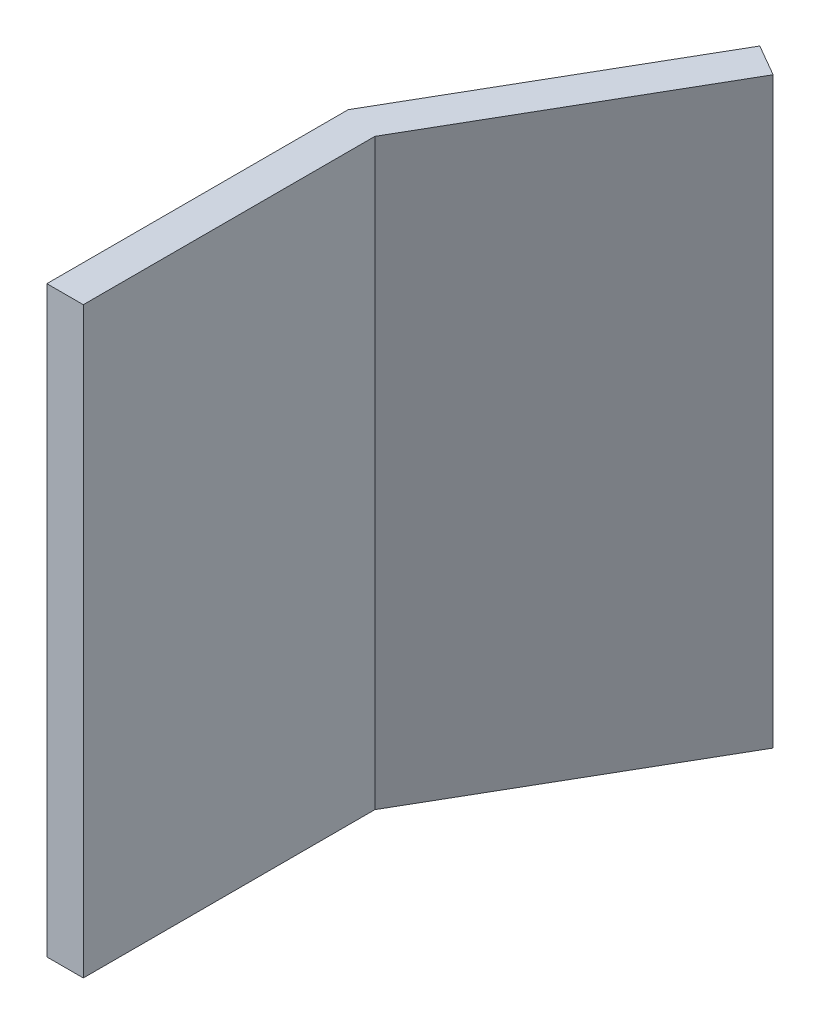
ISO-10303-21;
HEADER;
FILE_DESCRIPTION(('STEP AP214'),'2;1');
FILE_NAME('part.step','',(''),(''),'','','');
FILE_SCHEMA(('AUTOMOTIVE_DESIGN { 1 0 10303 214 1 1 1 1 }'));
ENDSEC;
DATA;
#1=APPLICATION_CONTEXT('core data for automotive mechanical design processes');
#2=APPLICATION_PROTOCOL_DEFINITION('international standard','automotive_design',2000,#1);
#3=PRODUCT_CONTEXT('',#1,'mechanical');
#4=PRODUCT('Part','Part','',(#3));
#5=PRODUCT_RELATED_PRODUCT_CATEGORY('part','',(#4));
#6=PRODUCT_DEFINITION_FORMATION('','',#4);
#7=PRODUCT_DEFINITION_CONTEXT('part definition',#1,'design');
#8=PRODUCT_DEFINITION('design','',#6,#7);
#9=PRODUCT_DEFINITION_SHAPE('','',#8);
#10=(LENGTH_UNIT() NAMED_UNIT(*) SI_UNIT(.MILLI.,.METRE.));
#11=(NAMED_UNIT(*) PLANE_ANGLE_UNIT() SI_UNIT($,.RADIAN.));
#12=(NAMED_UNIT(*) SI_UNIT($,.STERADIAN.) SOLID_ANGLE_UNIT());
#13=UNCERTAINTY_MEASURE_WITH_UNIT(LENGTH_MEASURE(1.E-05),#10,'distance_accuracy_value','');
#14=(GEOMETRIC_REPRESENTATION_CONTEXT(3) GLOBAL_UNCERTAINTY_ASSIGNED_CONTEXT((#13)) GLOBAL_UNIT_ASSIGNED_CONTEXT((#10,
#11,#12)) REPRESENTATION_CONTEXT('',''));
#15=CARTESIAN_POINT('',(0.,0.,0.));
#16=DIRECTION('',(0.,0.,1.));
#17=DIRECTION('',(1.,0.,0.));
#18=AXIS2_PLACEMENT_3D('',#15,#16,#17);
#19=CARTESIAN_POINT('',(3.175,50.8,0.));
#20=DIRECTION('',(1.,0.,0.));
#21=DIRECTION('',(0.,0.,-1.));
#22=AXIS2_PLACEMENT_3D('',#19,#20,#21);
#23=PLANE('',#22);
#24=DIRECTION('',(0.,0.,1.));
#25=VECTOR('',#24,1.);
#26=CARTESIAN_POINT('',(3.175,0.,0.));
#27=LINE('',#26,#25);
#28=CARTESIAN_POINT('',(3.175,0.,0.8507386859688));
#29=VERTEX_POINT('',#28);
#30=CARTESIAN_POINT('',(3.175,0.,26.2507386859688));
#31=VERTEX_POINT('',#30);
#32=EDGE_CURVE('E127',#29,#31,#27,.T.);
#33=ORIENTED_EDGE('',*,*,#32,.F.);
#34=DIRECTION('',(0.,-1.,0.));
#35=VECTOR('',#34,1.);
#36=CARTESIAN_POINT('',(3.175,50.8,0.8507386859688));
#37=LINE('',#36,#35);
#38=CARTESIAN_POINT('',(3.175,50.8,0.8507386859688));
#39=VERTEX_POINT('',#38);
#40=EDGE_CURVE('E11',#39,#29,#37,.T.);
#41=ORIENTED_EDGE('',*,*,#40,.F.);
#42=DIRECTION('',(0.,0.,1.));
#43=VECTOR('',#42,1.);
#44=CARTESIAN_POINT('',(3.175,50.8,0.));
#45=LINE('',#44,#43);
#46=CARTESIAN_POINT('',(3.175,50.8,26.2507386859688));
#47=VERTEX_POINT('',#46);
#48=EDGE_CURVE('E140',#39,#47,#45,.T.);
#49=ORIENTED_EDGE('',*,*,#48,.T.);
#50=DIRECTION('',(0.,-1.,0.));
#51=VECTOR('',#50,1.);
#52=CARTESIAN_POINT('',(3.175,50.8,26.2507386859688));
#53=LINE('',#52,#51);
#54=EDGE_CURVE('E87',#47,#31,#53,.T.);
#55=ORIENTED_EDGE('',*,*,#54,.T.);
#56=EDGE_LOOP('',(#33,#41,#49,#55));
#57=FACE_BOUND('',#56,.T.);
#58=ADVANCED_FACE('F41',(#57),#23,.T.);
#59=CARTESIAN_POINT('',(2.74963065701558,50.8,1.5875));
#60=DIRECTION('',(0.866025403784438,0.,0.500000000000001));
#61=DIRECTION('',(0.500000000000001,0.,-0.866025403784438));
#62=AXIS2_PLACEMENT_3D('',#59,#60,#61);
#63=PLANE('',#62);
#64=DIRECTION('',(-0.500000000000001,0.,0.866025403784438));
#65=VECTOR('',#64,1.);
#66=CARTESIAN_POINT('',(2.74963065701558,0.,1.5875));
#67=LINE('',#66,#65);
#68=CARTESIAN_POINT('',(15.875,0.,-21.1463065701559));
#69=VERTEX_POINT('',#68);
#70=EDGE_CURVE('E130',#69,#29,#67,.T.);
#71=ORIENTED_EDGE('',*,*,#70,.F.);
#72=DIRECTION('',(0.,-1.,0.));
#73=VECTOR('',#72,1.);
#74=CARTESIAN_POINT('',(15.875,50.8,-21.1463065701559));
#75=LINE('',#74,#73);
#76=CARTESIAN_POINT('',(15.875,50.8,-21.1463065701559));
#77=VERTEX_POINT('',#76);
#78=EDGE_CURVE('E50',#77,#69,#75,.T.);
#79=ORIENTED_EDGE('',*,*,#78,.F.);
#80=DIRECTION('',(-0.500000000000001,0.,0.866025403784438));
#81=VECTOR('',#80,1.);
#82=CARTESIAN_POINT('',(2.74963065701558,50.8,1.5875));
#83=LINE('',#82,#81);
#84=EDGE_CURVE('E155',#77,#39,#83,.T.);
#85=ORIENTED_EDGE('',*,*,#84,.T.);
#86=ORIENTED_EDGE('',*,*,#40,.T.);
#87=EDGE_LOOP('',(#71,#79,#85,#86));
#88=FACE_BOUND('',#87,.T.);
#89=ADVANCED_FACE('F149',(#88),#63,.T.);
#90=CARTESIAN_POINT('',(13.1253693429844,50.8,-22.7338065701559));
#91=DIRECTION('',(0.499999999999999,0.,-0.866025403784439));
#92=DIRECTION('',(-0.86602540378444,0.,-0.499999999999999));
#93=AXIS2_PLACEMENT_3D('',#90,#91,#92);
#94=PLANE('',#93);
#95=DIRECTION('',(0.86602540378444,0.,0.499999999999999));
#96=VECTOR('',#95,1.);
#97=CARTESIAN_POINT('',(13.1253693429844,0.,-22.7338065701559));
#98=LINE('',#97,#96);
#99=CARTESIAN_POINT('',(13.1253693429844,0.,-22.7338065701559));
#100=VERTEX_POINT('',#99);
#101=EDGE_CURVE('E133',#100,#69,#98,.T.);
#102=ORIENTED_EDGE('',*,*,#101,.F.);
#103=DIRECTION('',(0.,-1.,0.));
#104=VECTOR('',#103,1.);
#105=CARTESIAN_POINT('',(13.1253693429844,50.8,-22.7338065701559));
#106=LINE('',#105,#104);
#107=CARTESIAN_POINT('',(13.1253693429844,50.8,-22.7338065701559));
#108=VERTEX_POINT('',#107);
#109=EDGE_CURVE('E116',#108,#100,#106,.T.);
#110=ORIENTED_EDGE('',*,*,#109,.F.);
#111=DIRECTION('',(0.86602540378444,0.,0.499999999999999));
#112=VECTOR('',#111,1.);
#113=CARTESIAN_POINT('',(13.1253693429844,50.8,-22.7338065701559));
#114=LINE('',#113,#112);
#115=EDGE_CURVE('E108',#108,#77,#114,.T.);
#116=ORIENTED_EDGE('',*,*,#115,.T.);
#117=ORIENTED_EDGE('',*,*,#78,.T.);
#118=EDGE_LOOP('',(#102,#110,#116,#117));
#119=FACE_BOUND('',#118,.T.);
#120=ADVANCED_FACE('F146',(#119),#94,.T.);
#121=CARTESIAN_POINT('',(0.,50.8,0.));
#122=DIRECTION('',(0.866025403784438,0.,0.5));
#123=DIRECTION('',(0.5,0.,-0.866025403784438));
#124=AXIS2_PLACEMENT_3D('',#121,#122,#123);
#125=PLANE('',#124);
#126=DIRECTION('',(-0.5,0.,0.866025403784438));
#127=VECTOR('',#126,1.);
#128=CARTESIAN_POINT('',(0.,0.,0.));
#129=LINE('',#128,#127);
#130=CARTESIAN_POINT('',(0.,0.,0.));
#131=VERTEX_POINT('',#130);
#132=EDGE_CURVE('E114',#100,#131,#129,.T.);
#133=ORIENTED_EDGE('',*,*,#132,.T.);
#134=DIRECTION('',(0.,-1.,0.));
#135=VECTOR('',#134,1.);
#136=CARTESIAN_POINT('',(0.,50.8,0.));
#137=LINE('',#136,#135);
#138=CARTESIAN_POINT('',(0.,50.8,0.));
#139=VERTEX_POINT('',#138);
#140=EDGE_CURVE('E111',#139,#131,#137,.T.);
#141=ORIENTED_EDGE('',*,*,#140,.F.);
#142=DIRECTION('',(-0.5,0.,0.866025403784438));
#143=VECTOR('',#142,1.);
#144=CARTESIAN_POINT('',(0.,50.8,0.));
#145=LINE('',#144,#143);
#146=EDGE_CURVE('E101',#108,#139,#145,.T.);
#147=ORIENTED_EDGE('',*,*,#146,.F.);
#148=ORIENTED_EDGE('',*,*,#109,.T.);
#149=EDGE_LOOP('',(#133,#141,#147,#148));
#150=FACE_BOUND('',#149,.T.);
#151=ADVANCED_FACE('F112',(#150),#125,.F.);
#152=CARTESIAN_POINT('',(0.,50.8,0.));
#153=DIRECTION('',(1.,0.,0.));
#154=DIRECTION('',(0.,0.,-1.));
#155=AXIS2_PLACEMENT_3D('',#152,#153,#154);
#156=PLANE('',#155);
#157=DIRECTION('',(0.,0.,1.));
#158=VECTOR('',#157,1.);
#159=CARTESIAN_POINT('',(0.,0.,0.));
#160=LINE('',#159,#158);
#161=CARTESIAN_POINT('',(0.,0.,26.2507386859688));
#162=VERTEX_POINT('',#161);
#163=EDGE_CURVE('E80',#131,#162,#160,.T.);
#164=ORIENTED_EDGE('',*,*,#163,.T.);
#165=DIRECTION('',(0.,-1.,0.));
#166=VECTOR('',#165,1.);
#167=CARTESIAN_POINT('',(0.,50.8,26.2507386859688));
#168=LINE('',#167,#166);
#169=CARTESIAN_POINT('',(0.,50.8,26.2507386859688));
#170=VERTEX_POINT('',#169);
#171=EDGE_CURVE('E117',#170,#162,#168,.T.);
#172=ORIENTED_EDGE('',*,*,#171,.F.);
#173=DIRECTION('',(0.,0.,1.));
#174=VECTOR('',#173,1.);
#175=CARTESIAN_POINT('',(0.,50.8,0.));
#176=LINE('',#175,#174);
#177=EDGE_CURVE('E105',#139,#170,#176,.T.);
#178=ORIENTED_EDGE('',*,*,#177,.F.);
#179=ORIENTED_EDGE('',*,*,#140,.T.);
#180=EDGE_LOOP('',(#164,#172,#178,#179));
#181=FACE_BOUND('',#180,.T.);
#182=ADVANCED_FACE('F119',(#181),#156,.F.);
#183=CARTESIAN_POINT('',(0.,50.8,26.2507386859688));
#184=DIRECTION('',(0.,0.,-1.));
#185=DIRECTION('',(-1.,0.,0.));
#186=AXIS2_PLACEMENT_3D('',#183,#184,#185);
#187=PLANE('',#186);
#188=DIRECTION('',(1.,0.,0.));
#189=VECTOR('',#188,1.);
#190=CARTESIAN_POINT('',(0.,0.,26.2507386859688));
#191=LINE('',#190,#189);
#192=EDGE_CURVE('E138',#162,#31,#191,.T.);
#193=ORIENTED_EDGE('',*,*,#192,.T.);
#194=ORIENTED_EDGE('',*,*,#54,.F.);
#195=DIRECTION('',(1.,0.,0.));
#196=VECTOR('',#195,1.);
#197=CARTESIAN_POINT('',(0.,50.8,26.2507386859688));
#198=LINE('',#197,#196);
#199=EDGE_CURVE('E58',#170,#47,#198,.T.);
#200=ORIENTED_EDGE('',*,*,#199,.F.);
#201=ORIENTED_EDGE('',*,*,#171,.T.);
#202=EDGE_LOOP('',(#193,#194,#200,#201));
#203=FACE_BOUND('',#202,.T.);
#204=ADVANCED_FACE('F154',(#203),#187,.F.);
#205=CARTESIAN_POINT('',(0.,50.8,0.));
#206=DIRECTION('',(0.,1.,0.));
#207=DIRECTION('',(0.,0.,1.));
#208=AXIS2_PLACEMENT_3D('',#205,#206,#207);
#209=PLANE('',#208);
#210=ORIENTED_EDGE('',*,*,#48,.F.);
#211=ORIENTED_EDGE('',*,*,#84,.F.);
#212=ORIENTED_EDGE('',*,*,#115,.F.);
#213=ORIENTED_EDGE('',*,*,#146,.T.);
#214=ORIENTED_EDGE('',*,*,#177,.T.);
#215=ORIENTED_EDGE('',*,*,#199,.T.);
#216=EDGE_LOOP('',(#210,#211,#212,#213,#214,#215));
#217=FACE_BOUND('',#216,.T.);
#218=ADVANCED_FACE('F103',(#217),#209,.T.);
#219=CARTESIAN_POINT('',(0.,0.,0.));
#220=DIRECTION('',(0.,1.,0.));
#221=DIRECTION('',(0.,0.,1.));
#222=AXIS2_PLACEMENT_3D('',#219,#220,#221);
#223=PLANE('',#222);
#224=ORIENTED_EDGE('',*,*,#32,.T.);
#225=ORIENTED_EDGE('',*,*,#192,.F.);
#226=ORIENTED_EDGE('',*,*,#163,.F.);
#227=ORIENTED_EDGE('',*,*,#132,.F.);
#228=ORIENTED_EDGE('',*,*,#101,.T.);
#229=ORIENTED_EDGE('',*,*,#70,.T.);
#230=EDGE_LOOP('',(#224,#225,#226,#227,#228,#229));
#231=FACE_BOUND('',#230,.T.);
#232=ADVANCED_FACE('F151',(#231),#223,.F.);
#233=CLOSED_SHELL('',(#58,#89,#120,#151,#182,#204,#218,#232));
#234=MANIFOLD_SOLID_BREP('B2',#233);
#235=ADVANCED_BREP_SHAPE_REPRESENTATION('',(#18,#234),#14);
#236=SHAPE_DEFINITION_REPRESENTATION(#9,#235);
ENDSEC;
END-ISO-10303-21;
